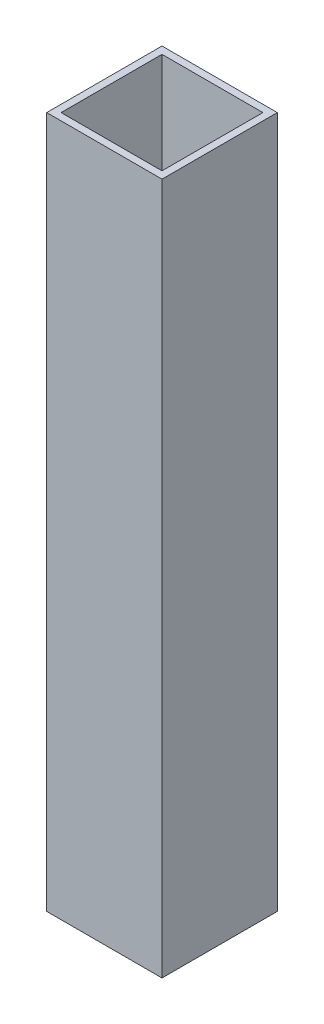
ISO-10303-21;
HEADER;
FILE_DESCRIPTION(('STEP AP214'),'2;1');
FILE_NAME('part.step','',(''),(''),'','','');
FILE_SCHEMA(('AUTOMOTIVE_DESIGN { 1 0 10303 214 1 1 1 1 }'));
ENDSEC;
DATA;
#1=APPLICATION_CONTEXT('core data for automotive mechanical design processes');
#2=APPLICATION_PROTOCOL_DEFINITION('international standard','automotive_design',2000,#1);
#3=PRODUCT_CONTEXT('',#1,'mechanical');
#4=PRODUCT('Part','Part','',(#3));
#5=PRODUCT_RELATED_PRODUCT_CATEGORY('part','',(#4));
#6=PRODUCT_DEFINITION_FORMATION('','',#4);
#7=PRODUCT_DEFINITION_CONTEXT('part definition',#1,'design');
#8=PRODUCT_DEFINITION('design','',#6,#7);
#9=PRODUCT_DEFINITION_SHAPE('','',#8);
#10=(LENGTH_UNIT() NAMED_UNIT(*) SI_UNIT(.MILLI.,.METRE.));
#11=(NAMED_UNIT(*) PLANE_ANGLE_UNIT() SI_UNIT($,.RADIAN.));
#12=(NAMED_UNIT(*) SI_UNIT($,.STERADIAN.) SOLID_ANGLE_UNIT());
#13=UNCERTAINTY_MEASURE_WITH_UNIT(LENGTH_MEASURE(1.E-05),#10,'distance_accuracy_value','');
#14=(GEOMETRIC_REPRESENTATION_CONTEXT(3) GLOBAL_UNCERTAINTY_ASSIGNED_CONTEXT((#13)) GLOBAL_UNIT_ASSIGNED_CONTEXT((#10,
#11,#12)) REPRESENTATION_CONTEXT('',''));
#15=CARTESIAN_POINT('',(0.,0.,0.));
#16=DIRECTION('',(0.,0.,1.));
#17=DIRECTION('',(1.,0.,0.));
#18=AXIS2_PLACEMENT_3D('',#15,#16,#17);
#19=CARTESIAN_POINT('',(0.,152.4,0.));
#20=DIRECTION('',(0.,-1.,0.));
#21=DIRECTION('',(0.,0.,-1.));
#22=AXIS2_PLACEMENT_3D('',#19,#20,#21);
#23=PLANE('',#22);
#24=DIRECTION('',(0.,0.,-1.));
#25=VECTOR('',#24,1.);
#26=CARTESIAN_POINT('',(12.7,152.4,12.7));
#27=LINE('',#26,#25);
#28=CARTESIAN_POINT('',(12.7,152.4,12.7));
#29=VERTEX_POINT('',#28);
#30=CARTESIAN_POINT('',(12.7,152.4,-12.7));
#31=VERTEX_POINT('',#30);
#32=EDGE_CURVE('E134',#29,#31,#27,.T.);
#33=ORIENTED_EDGE('',*,*,#32,.T.);
#34=DIRECTION('',(-1.,0.,0.));
#35=VECTOR('',#34,1.);
#36=CARTESIAN_POINT('',(-12.7,152.4,-12.7));
#37=LINE('',#36,#35);
#38=CARTESIAN_POINT('',(-12.7,152.4,-12.7));
#39=VERTEX_POINT('',#38);
#40=EDGE_CURVE('E137',#31,#39,#37,.T.);
#41=ORIENTED_EDGE('',*,*,#40,.T.);
#42=DIRECTION('',(0.,0.,1.));
#43=VECTOR('',#42,1.);
#44=CARTESIAN_POINT('',(-12.7,152.4,12.7));
#45=LINE('',#44,#43);
#46=CARTESIAN_POINT('',(-12.7,152.4,12.7));
#47=VERTEX_POINT('',#46);
#48=EDGE_CURVE('E140',#39,#47,#45,.T.);
#49=ORIENTED_EDGE('',*,*,#48,.T.);
#50=DIRECTION('',(1.,0.,0.));
#51=VECTOR('',#50,1.);
#52=CARTESIAN_POINT('',(-12.7,152.4,12.7));
#53=LINE('',#52,#51);
#54=EDGE_CURVE('E142',#47,#29,#53,.T.);
#55=ORIENTED_EDGE('',*,*,#54,.T.);
#56=EDGE_LOOP('',(#33,#41,#49,#55));
#57=FACE_BOUND('',#56,.T.);
#58=DIRECTION('',(0.,0.,-1.));
#59=VECTOR('',#58,1.);
#60=CARTESIAN_POINT('',(11.1125,152.4,11.1125));
#61=LINE('',#60,#59);
#62=CARTESIAN_POINT('',(11.1125,152.4,11.1125));
#63=VERTEX_POINT('',#62);
#64=CARTESIAN_POINT('',(11.1125,152.4,-11.1125));
#65=VERTEX_POINT('',#64);
#66=EDGE_CURVE('E98',#63,#65,#61,.T.);
#67=ORIENTED_EDGE('',*,*,#66,.F.);
#68=DIRECTION('',(1.,0.,0.));
#69=VECTOR('',#68,1.);
#70=CARTESIAN_POINT('',(-11.1125,152.4,11.1125));
#71=LINE('',#70,#69);
#72=CARTESIAN_POINT('',(-11.1125,152.4,11.1125));
#73=VERTEX_POINT('',#72);
#74=EDGE_CURVE('E120',#73,#63,#71,.T.);
#75=ORIENTED_EDGE('',*,*,#74,.F.);
#76=DIRECTION('',(0.,0.,1.));
#77=VECTOR('',#76,1.);
#78=CARTESIAN_POINT('',(-11.1125,152.4,11.1125));
#79=LINE('',#78,#77);
#80=CARTESIAN_POINT('',(-11.1125,152.4,-11.1125));
#81=VERTEX_POINT('',#80);
#82=EDGE_CURVE('E118',#81,#73,#79,.T.);
#83=ORIENTED_EDGE('',*,*,#82,.F.);
#84=DIRECTION('',(-1.,0.,0.));
#85=VECTOR('',#84,1.);
#86=CARTESIAN_POINT('',(-11.1125,152.4,-11.1125));
#87=LINE('',#86,#85);
#88=EDGE_CURVE('E106',#65,#81,#87,.T.);
#89=ORIENTED_EDGE('',*,*,#88,.F.);
#90=EDGE_LOOP('',(#67,#75,#83,#89));
#91=FACE_BOUND('',#90,.T.);
#92=ADVANCED_FACE('F33',(#57,#91),#23,.F.);
#93=CARTESIAN_POINT('',(0.,0.,0.));
#94=DIRECTION('',(0.,-1.,0.));
#95=DIRECTION('',(0.,0.,-1.));
#96=AXIS2_PLACEMENT_3D('',#93,#94,#95);
#97=PLANE('',#96);
#98=DIRECTION('',(0.,0.,-1.));
#99=VECTOR('',#98,1.);
#100=CARTESIAN_POINT('',(12.7,0.,12.7));
#101=LINE('',#100,#99);
#102=CARTESIAN_POINT('',(12.7,0.,12.7));
#103=VERTEX_POINT('',#102);
#104=CARTESIAN_POINT('',(12.7,0.,-12.7));
#105=VERTEX_POINT('',#104);
#106=EDGE_CURVE('E114',#103,#105,#101,.T.);
#107=ORIENTED_EDGE('',*,*,#106,.F.);
#108=DIRECTION('',(1.,0.,0.));
#109=VECTOR('',#108,1.);
#110=CARTESIAN_POINT('',(-12.7,0.,12.7));
#111=LINE('',#110,#109);
#112=CARTESIAN_POINT('',(-12.7,0.,12.7));
#113=VERTEX_POINT('',#112);
#114=EDGE_CURVE('E138',#113,#103,#111,.T.);
#115=ORIENTED_EDGE('',*,*,#114,.F.);
#116=DIRECTION('',(0.,0.,1.));
#117=VECTOR('',#116,1.);
#118=CARTESIAN_POINT('',(-12.7,0.,12.7));
#119=LINE('',#118,#117);
#120=CARTESIAN_POINT('',(-12.7,0.,-12.7));
#121=VERTEX_POINT('',#120);
#122=EDGE_CURVE('E149',#121,#113,#119,.T.);
#123=ORIENTED_EDGE('',*,*,#122,.F.);
#124=DIRECTION('',(-1.,0.,0.));
#125=VECTOR('',#124,1.);
#126=CARTESIAN_POINT('',(-12.7,0.,-12.7));
#127=LINE('',#126,#125);
#128=EDGE_CURVE('E147',#105,#121,#127,.T.);
#129=ORIENTED_EDGE('',*,*,#128,.F.);
#130=EDGE_LOOP('',(#107,#115,#123,#129));
#131=FACE_BOUND('',#130,.T.);
#132=DIRECTION('',(1.,0.,0.));
#133=VECTOR('',#132,1.);
#134=CARTESIAN_POINT('',(-11.1125,0.,11.1125));
#135=LINE('',#134,#133);
#136=CARTESIAN_POINT('',(-11.1125,0.,11.1125));
#137=VERTEX_POINT('',#136);
#138=CARTESIAN_POINT('',(11.1125,0.,11.1125));
#139=VERTEX_POINT('',#138);
#140=EDGE_CURVE('E107',#137,#139,#135,.T.);
#141=ORIENTED_EDGE('',*,*,#140,.T.);
#142=DIRECTION('',(0.,0.,-1.));
#143=VECTOR('',#142,1.);
#144=CARTESIAN_POINT('',(11.1125,0.,11.1125));
#145=LINE('',#144,#143);
#146=CARTESIAN_POINT('',(11.1125,0.,-11.1125));
#147=VERTEX_POINT('',#146);
#148=EDGE_CURVE('E56',#139,#147,#145,.T.);
#149=ORIENTED_EDGE('',*,*,#148,.T.);
#150=DIRECTION('',(-1.,0.,0.));
#151=VECTOR('',#150,1.);
#152=CARTESIAN_POINT('',(-11.1125,0.,-11.1125));
#153=LINE('',#152,#151);
#154=CARTESIAN_POINT('',(-11.1125,0.,-11.1125));
#155=VERTEX_POINT('',#154);
#156=EDGE_CURVE('E113',#147,#155,#153,.T.);
#157=ORIENTED_EDGE('',*,*,#156,.T.);
#158=DIRECTION('',(0.,0.,1.));
#159=VECTOR('',#158,1.);
#160=CARTESIAN_POINT('',(-11.1125,0.,11.1125));
#161=LINE('',#160,#159);
#162=EDGE_CURVE('E126',#155,#137,#161,.T.);
#163=ORIENTED_EDGE('',*,*,#162,.T.);
#164=EDGE_LOOP('',(#141,#149,#157,#163));
#165=FACE_BOUND('',#164,.T.);
#166=ADVANCED_FACE('F167',(#131,#165),#97,.T.);
#167=CARTESIAN_POINT('',(12.7,152.4,12.7));
#168=DIRECTION('',(-1.,0.,0.));
#169=DIRECTION('',(0.,0.,1.));
#170=AXIS2_PLACEMENT_3D('',#167,#168,#169);
#171=PLANE('',#170);
#172=ORIENTED_EDGE('',*,*,#106,.T.);
#173=DIRECTION('',(0.,-1.,0.));
#174=VECTOR('',#173,1.);
#175=CARTESIAN_POINT('',(12.7,152.4,-12.7));
#176=LINE('',#175,#174);
#177=EDGE_CURVE('E11',#31,#105,#176,.T.);
#178=ORIENTED_EDGE('',*,*,#177,.F.);
#179=ORIENTED_EDGE('',*,*,#32,.F.);
#180=DIRECTION('',(0.,-1.,0.));
#181=VECTOR('',#180,1.);
#182=CARTESIAN_POINT('',(12.7,152.4,12.7));
#183=LINE('',#182,#181);
#184=EDGE_CURVE('E144',#29,#103,#183,.T.);
#185=ORIENTED_EDGE('',*,*,#184,.T.);
#186=EDGE_LOOP('',(#172,#178,#179,#185));
#187=FACE_BOUND('',#186,.T.);
#188=ADVANCED_FACE('F35',(#187),#171,.F.);
#189=CARTESIAN_POINT('',(-12.7,152.4,-12.7));
#190=DIRECTION('',(0.,0.,1.));
#191=DIRECTION('',(1.,0.,0.));
#192=AXIS2_PLACEMENT_3D('',#189,#190,#191);
#193=PLANE('',#192);
#194=ORIENTED_EDGE('',*,*,#128,.T.);
#195=DIRECTION('',(0.,-1.,0.));
#196=VECTOR('',#195,1.);
#197=CARTESIAN_POINT('',(-12.7,152.4,-12.7));
#198=LINE('',#197,#196);
#199=EDGE_CURVE('E41',#39,#121,#198,.T.);
#200=ORIENTED_EDGE('',*,*,#199,.F.);
#201=ORIENTED_EDGE('',*,*,#40,.F.);
#202=ORIENTED_EDGE('',*,*,#177,.T.);
#203=EDGE_LOOP('',(#194,#200,#201,#202));
#204=FACE_BOUND('',#203,.T.);
#205=ADVANCED_FACE('F177',(#204),#193,.F.);
#206=CARTESIAN_POINT('',(-12.7,152.4,12.7));
#207=DIRECTION('',(1.,0.,0.));
#208=DIRECTION('',(0.,0.,-1.));
#209=AXIS2_PLACEMENT_3D('',#206,#207,#208);
#210=PLANE('',#209);
#211=ORIENTED_EDGE('',*,*,#122,.T.);
#212=DIRECTION('',(0.,-1.,0.));
#213=VECTOR('',#212,1.);
#214=CARTESIAN_POINT('',(-12.7,152.4,12.7));
#215=LINE('',#214,#213);
#216=EDGE_CURVE('E154',#47,#113,#215,.T.);
#217=ORIENTED_EDGE('',*,*,#216,.F.);
#218=ORIENTED_EDGE('',*,*,#48,.F.);
#219=ORIENTED_EDGE('',*,*,#199,.T.);
#220=EDGE_LOOP('',(#211,#217,#218,#219));
#221=FACE_BOUND('',#220,.T.);
#222=ADVANCED_FACE('F161',(#221),#210,.F.);
#223=CARTESIAN_POINT('',(-12.7,152.4,12.7));
#224=DIRECTION('',(0.,0.,-1.));
#225=DIRECTION('',(-1.,0.,0.));
#226=AXIS2_PLACEMENT_3D('',#223,#224,#225);
#227=PLANE('',#226);
#228=ORIENTED_EDGE('',*,*,#114,.T.);
#229=ORIENTED_EDGE('',*,*,#184,.F.);
#230=ORIENTED_EDGE('',*,*,#54,.F.);
#231=ORIENTED_EDGE('',*,*,#216,.T.);
#232=EDGE_LOOP('',(#228,#229,#230,#231));
#233=FACE_BOUND('',#232,.T.);
#234=ADVANCED_FACE('F171',(#233),#227,.F.);
#235=CARTESIAN_POINT('',(11.1125,152.4,11.1125));
#236=DIRECTION('',(-1.,0.,0.));
#237=DIRECTION('',(0.,0.,1.));
#238=AXIS2_PLACEMENT_3D('',#235,#236,#237);
#239=PLANE('',#238);
#240=ORIENTED_EDGE('',*,*,#148,.F.);
#241=DIRECTION('',(0.,-1.,0.));
#242=VECTOR('',#241,1.);
#243=CARTESIAN_POINT('',(11.1125,152.4,11.1125));
#244=LINE('',#243,#242);
#245=EDGE_CURVE('E102',#63,#139,#244,.T.);
#246=ORIENTED_EDGE('',*,*,#245,.F.);
#247=ORIENTED_EDGE('',*,*,#66,.T.);
#248=DIRECTION('',(0.,-1.,0.));
#249=VECTOR('',#248,1.);
#250=CARTESIAN_POINT('',(11.1125,152.4,-11.1125));
#251=LINE('',#250,#249);
#252=EDGE_CURVE('E101',#65,#147,#251,.T.);
#253=ORIENTED_EDGE('',*,*,#252,.T.);
#254=EDGE_LOOP('',(#240,#246,#247,#253));
#255=FACE_BOUND('',#254,.T.);
#256=ADVANCED_FACE('F100',(#255),#239,.T.);
#257=CARTESIAN_POINT('',(-11.1125,152.4,-11.1125));
#258=DIRECTION('',(0.,0.,1.));
#259=DIRECTION('',(1.,0.,0.));
#260=AXIS2_PLACEMENT_3D('',#257,#258,#259);
#261=PLANE('',#260);
#262=ORIENTED_EDGE('',*,*,#156,.F.);
#263=ORIENTED_EDGE('',*,*,#252,.F.);
#264=ORIENTED_EDGE('',*,*,#88,.T.);
#265=DIRECTION('',(0.,-1.,0.));
#266=VECTOR('',#265,1.);
#267=CARTESIAN_POINT('',(-11.1125,152.4,-11.1125));
#268=LINE('',#267,#266);
#269=EDGE_CURVE('E115',#81,#155,#268,.T.);
#270=ORIENTED_EDGE('',*,*,#269,.T.);
#271=EDGE_LOOP('',(#262,#263,#264,#270));
#272=FACE_BOUND('',#271,.T.);
#273=ADVANCED_FACE('F110',(#272),#261,.T.);
#274=CARTESIAN_POINT('',(-11.1125,152.4,11.1125));
#275=DIRECTION('',(1.,0.,0.));
#276=DIRECTION('',(0.,0.,-1.));
#277=AXIS2_PLACEMENT_3D('',#274,#275,#276);
#278=PLANE('',#277);
#279=ORIENTED_EDGE('',*,*,#162,.F.);
#280=ORIENTED_EDGE('',*,*,#269,.F.);
#281=ORIENTED_EDGE('',*,*,#82,.T.);
#282=DIRECTION('',(0.,-1.,0.));
#283=VECTOR('',#282,1.);
#284=CARTESIAN_POINT('',(-11.1125,152.4,11.1125));
#285=LINE('',#284,#283);
#286=EDGE_CURVE('E48',#73,#137,#285,.T.);
#287=ORIENTED_EDGE('',*,*,#286,.T.);
#288=EDGE_LOOP('',(#279,#280,#281,#287));
#289=FACE_BOUND('',#288,.T.);
#290=ADVANCED_FACE('F200',(#289),#278,.T.);
#291=CARTESIAN_POINT('',(-11.1125,152.4,11.1125));
#292=DIRECTION('',(0.,0.,-1.));
#293=DIRECTION('',(-1.,0.,0.));
#294=AXIS2_PLACEMENT_3D('',#291,#292,#293);
#295=PLANE('',#294);
#296=ORIENTED_EDGE('',*,*,#140,.F.);
#297=ORIENTED_EDGE('',*,*,#286,.F.);
#298=ORIENTED_EDGE('',*,*,#74,.T.);
#299=ORIENTED_EDGE('',*,*,#245,.T.);
#300=EDGE_LOOP('',(#296,#297,#298,#299));
#301=FACE_BOUND('',#300,.T.);
#302=ADVANCED_FACE('F204',(#301),#295,.T.);
#303=CLOSED_SHELL('',(#92,#166,#188,#205,#222,#234,#256,#273,#290,#302));
#304=MANIFOLD_SOLID_BREP('B2',#303);
#305=ADVANCED_BREP_SHAPE_REPRESENTATION('',(#18,#304),#14);
#306=SHAPE_DEFINITION_REPRESENTATION(#9,#305);
ENDSEC;
END-ISO-10303-21;
